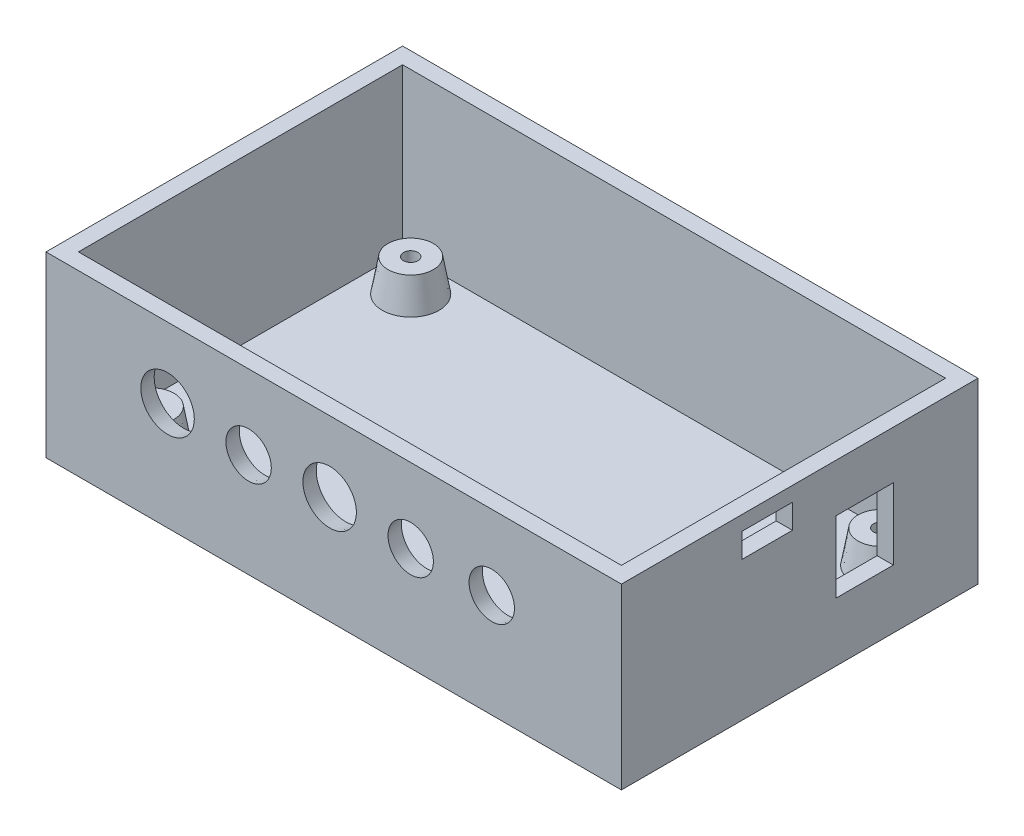
ISO-10303-21;
HEADER;
FILE_DESCRIPTION(('STEP AP214'),'2;1');
FILE_NAME('part.step','',(''),(''),'','','');
FILE_SCHEMA(('AUTOMOTIVE_DESIGN { 1 0 10303 214 1 1 1 1 }'));
ENDSEC;
DATA;
#1=APPLICATION_CONTEXT('core data for automotive mechanical design processes');
#2=APPLICATION_PROTOCOL_DEFINITION('international standard','automotive_design',2000,#1);
#3=PRODUCT_CONTEXT('',#1,'mechanical');
#4=PRODUCT('Part','Part','',(#3));
#5=PRODUCT_RELATED_PRODUCT_CATEGORY('part','',(#4));
#6=PRODUCT_DEFINITION_FORMATION('','',#4);
#7=PRODUCT_DEFINITION_CONTEXT('part definition',#1,'design');
#8=PRODUCT_DEFINITION('design','',#6,#7);
#9=PRODUCT_DEFINITION_SHAPE('','',#8);
#10=(LENGTH_UNIT() NAMED_UNIT(*) SI_UNIT(.MILLI.,.METRE.));
#11=(NAMED_UNIT(*) PLANE_ANGLE_UNIT() SI_UNIT($,.RADIAN.));
#12=(NAMED_UNIT(*) SI_UNIT($,.STERADIAN.) SOLID_ANGLE_UNIT());
#13=UNCERTAINTY_MEASURE_WITH_UNIT(LENGTH_MEASURE(1.E-05),#10,'distance_accuracy_value','');
#14=(GEOMETRIC_REPRESENTATION_CONTEXT(3) GLOBAL_UNCERTAINTY_ASSIGNED_CONTEXT((#13)) GLOBAL_UNIT_ASSIGNED_CONTEXT((#10,
#11,#12)) REPRESENTATION_CONTEXT('',''));
#15=CARTESIAN_POINT('',(0.,0.,0.));
#16=DIRECTION('',(0.,0.,1.));
#17=DIRECTION('',(1.,0.,0.));
#18=AXIS2_PLACEMENT_3D('',#15,#16,#17);
#19=CARTESIAN_POINT('',(45.085,27.94,-27.94));
#20=DIRECTION('',(-1.,0.,0.));
#21=DIRECTION('',(0.,0.,1.));
#22=AXIS2_PLACEMENT_3D('',#19,#20,#21);
#23=PLANE('',#22);
#24=DIRECTION('',(0.,0.,1.));
#25=VECTOR('',#24,1.);
#26=CARTESIAN_POINT('',(45.085,20.3962,-5.65150000000001));
#27=LINE('',#26,#25);
#28=CARTESIAN_POINT('',(45.085,20.3962,-14.6685));
#29=VERTEX_POINT('',#28);
#30=CARTESIAN_POINT('',(45.085,20.3962,-5.65150000000001));
#31=VERTEX_POINT('',#30);
#32=EDGE_CURVE('E181',#29,#31,#27,.T.);
#33=ORIENTED_EDGE('',*,*,#32,.F.);
#34=DIRECTION('',(0.,1.,0.));
#35=VECTOR('',#34,1.);
#36=CARTESIAN_POINT('',(45.085,9.2202,-14.6685));
#37=LINE('',#36,#35);
#38=CARTESIAN_POINT('',(45.085,9.2202,-14.6685));
#39=VERTEX_POINT('',#38);
#40=EDGE_CURVE('E47',#39,#29,#37,.T.);
#41=ORIENTED_EDGE('',*,*,#40,.F.);
#42=DIRECTION('',(0.,0.,-1.));
#43=VECTOR('',#42,1.);
#44=CARTESIAN_POINT('',(45.085,9.2202,-5.65150000000001));
#45=LINE('',#44,#43);
#46=CARTESIAN_POINT('',(45.085,9.2202,-5.65150000000001));
#47=VERTEX_POINT('',#46);
#48=EDGE_CURVE('E168',#47,#39,#45,.T.);
#49=ORIENTED_EDGE('',*,*,#48,.F.);
#50=DIRECTION('',(0.,-1.,0.));
#51=VECTOR('',#50,1.);
#52=CARTESIAN_POINT('',(45.085,9.2202,-5.65150000000001));
#53=LINE('',#52,#51);
#54=EDGE_CURVE('E176',#31,#47,#53,.T.);
#55=ORIENTED_EDGE('',*,*,#54,.F.);
#56=EDGE_LOOP('',(#33,#41,#49,#55));
#57=FACE_BOUND('',#56,.T.);
#58=DIRECTION('',(0.,0.,1.));
#59=VECTOR('',#58,1.);
#60=CARTESIAN_POINT('',(45.085,25.654,9.01700000000001));
#61=LINE('',#60,#59);
#62=CARTESIAN_POINT('',(45.085,25.654,1.14300000000001));
#63=VERTEX_POINT('',#62);
#64=CARTESIAN_POINT('',(45.085,25.654,9.01700000000001));
#65=VERTEX_POINT('',#64);
#66=EDGE_CURVE('E207',#63,#65,#61,.T.);
#67=ORIENTED_EDGE('',*,*,#66,.F.);
#68=DIRECTION('',(0.,1.,0.));
#69=VECTOR('',#68,1.);
#70=CARTESIAN_POINT('',(45.085,25.654,1.14300000000001));
#71=LINE('',#70,#69);
#72=CARTESIAN_POINT('',(45.085,21.844,1.14300000000001));
#73=VERTEX_POINT('',#72);
#74=EDGE_CURVE('E55',#73,#63,#71,.T.);
#75=ORIENTED_EDGE('',*,*,#74,.F.);
#76=DIRECTION('',(0.,0.,-1.));
#77=VECTOR('',#76,1.);
#78=CARTESIAN_POINT('',(45.085,21.844,9.01700000000001));
#79=LINE('',#78,#77);
#80=CARTESIAN_POINT('',(45.085,21.844,9.01700000000001));
#81=VERTEX_POINT('',#80);
#82=EDGE_CURVE('E191',#81,#73,#79,.T.);
#83=ORIENTED_EDGE('',*,*,#82,.F.);
#84=DIRECTION('',(0.,-1.,0.));
#85=VECTOR('',#84,1.);
#86=CARTESIAN_POINT('',(45.085,25.654,9.01700000000001));
#87=LINE('',#86,#85);
#88=EDGE_CURVE('E204',#65,#81,#87,.T.);
#89=ORIENTED_EDGE('',*,*,#88,.F.);
#90=EDGE_LOOP('',(#67,#75,#83,#89));
#91=FACE_BOUND('',#90,.T.);
#92=DIRECTION('',(0.,0.,-1.));
#93=VECTOR('',#92,1.);
#94=CARTESIAN_POINT('',(45.085,0.,-27.94));
#95=LINE('',#94,#93);
#96=CARTESIAN_POINT('',(45.085,0.,27.94));
#97=VERTEX_POINT('',#96);
#98=CARTESIAN_POINT('',(45.085,0.,-27.94));
#99=VERTEX_POINT('',#98);
#100=EDGE_CURVE('E310',#97,#99,#95,.T.);
#101=ORIENTED_EDGE('',*,*,#100,.T.);
#102=DIRECTION('',(0.,-1.,0.));
#103=VECTOR('',#102,1.);
#104=CARTESIAN_POINT('',(45.085,27.94,-27.94));
#105=LINE('',#104,#103);
#106=CARTESIAN_POINT('',(45.085,27.94,-27.94));
#107=VERTEX_POINT('',#106);
#108=EDGE_CURVE('E11',#107,#99,#105,.T.);
#109=ORIENTED_EDGE('',*,*,#108,.F.);
#110=DIRECTION('',(0.,0.,-1.));
#111=VECTOR('',#110,1.);
#112=CARTESIAN_POINT('',(45.085,27.94,-27.94));
#113=LINE('',#112,#111);
#114=CARTESIAN_POINT('',(45.085,27.94,27.94));
#115=VERTEX_POINT('',#114);
#116=EDGE_CURVE('E334',#115,#107,#113,.T.);
#117=ORIENTED_EDGE('',*,*,#116,.F.);
#118=DIRECTION('',(0.,-1.,0.));
#119=VECTOR('',#118,1.);
#120=CARTESIAN_POINT('',(45.085,27.94,27.94));
#121=LINE('',#120,#119);
#122=EDGE_CURVE('E344',#115,#97,#121,.T.);
#123=ORIENTED_EDGE('',*,*,#122,.T.);
#124=EDGE_LOOP('',(#101,#109,#117,#123));
#125=FACE_BOUND('',#124,.T.);
#126=ADVANCED_FACE('F33',(#57,#91,#125),#23,.F.);
#127=CARTESIAN_POINT('',(-45.085,27.94,-27.94));
#128=DIRECTION('',(0.,0.,1.));
#129=DIRECTION('',(1.,0.,0.));
#130=AXIS2_PLACEMENT_3D('',#127,#128,#129);
#131=PLANE('',#130);
#132=DIRECTION('',(-1.,0.,0.));
#133=VECTOR('',#132,1.);
#134=CARTESIAN_POINT('',(-45.085,0.,-27.94));
#135=LINE('',#134,#133);
#136=CARTESIAN_POINT('',(-45.085,0.,-27.94));
#137=VERTEX_POINT('',#136);
#138=EDGE_CURVE('E347',#99,#137,#135,.T.);
#139=ORIENTED_EDGE('',*,*,#138,.T.);
#140=DIRECTION('',(0.,-1.,0.));
#141=VECTOR('',#140,1.);
#142=CARTESIAN_POINT('',(-45.085,27.94,-27.94));
#143=LINE('',#142,#141);
#144=CARTESIAN_POINT('',(-45.085,27.94,-27.94));
#145=VERTEX_POINT('',#144);
#146=EDGE_CURVE('E40',#145,#137,#143,.T.);
#147=ORIENTED_EDGE('',*,*,#146,.F.);
#148=DIRECTION('',(-1.,0.,0.));
#149=VECTOR('',#148,1.);
#150=CARTESIAN_POINT('',(-45.085,27.94,-27.94));
#151=LINE('',#150,#149);
#152=EDGE_CURVE('E337',#107,#145,#151,.T.);
#153=ORIENTED_EDGE('',*,*,#152,.F.);
#154=ORIENTED_EDGE('',*,*,#108,.T.);
#155=EDGE_LOOP('',(#139,#147,#153,#154));
#156=FACE_BOUND('',#155,.T.);
#157=ADVANCED_FACE('F377',(#156),#131,.F.);
#158=CARTESIAN_POINT('',(-45.085,27.94,-27.94));
#159=DIRECTION('',(1.,0.,0.));
#160=DIRECTION('',(0.,0.,-1.));
#161=AXIS2_PLACEMENT_3D('',#158,#159,#160);
#162=PLANE('',#161);
#163=DIRECTION('',(0.,0.,1.));
#164=VECTOR('',#163,1.);
#165=CARTESIAN_POINT('',(-45.085,0.,-27.94));
#166=LINE('',#165,#164);
#167=CARTESIAN_POINT('',(-45.085,0.,27.94));
#168=VERTEX_POINT('',#167);
#169=EDGE_CURVE('E349',#137,#168,#166,.T.);
#170=ORIENTED_EDGE('',*,*,#169,.T.);
#171=DIRECTION('',(0.,-1.,0.));
#172=VECTOR('',#171,1.);
#173=CARTESIAN_POINT('',(-45.085,27.94,27.94));
#174=LINE('',#173,#172);
#175=CARTESIAN_POINT('',(-45.085,27.94,27.94));
#176=VERTEX_POINT('',#175);
#177=EDGE_CURVE('E354',#176,#168,#174,.T.);
#178=ORIENTED_EDGE('',*,*,#177,.F.);
#179=DIRECTION('',(0.,0.,1.));
#180=VECTOR('',#179,1.);
#181=CARTESIAN_POINT('',(-45.085,27.94,-27.94));
#182=LINE('',#181,#180);
#183=EDGE_CURVE('E340',#145,#176,#182,.T.);
#184=ORIENTED_EDGE('',*,*,#183,.F.);
#185=ORIENTED_EDGE('',*,*,#146,.T.);
#186=EDGE_LOOP('',(#170,#178,#184,#185));
#187=FACE_BOUND('',#186,.T.);
#188=ADVANCED_FACE('F361',(#187),#162,.F.);
#189=CARTESIAN_POINT('',(-45.085,27.94,27.94));
#190=DIRECTION('',(0.,0.,-1.));
#191=DIRECTION('',(-1.,0.,0.));
#192=AXIS2_PLACEMENT_3D('',#189,#190,#191);
#193=PLANE('',#192);
#194=CARTESIAN_POINT('',(24.765,16.256,27.94));
#195=DIRECTION('',(0.,0.,1.));
#196=DIRECTION('',(1.,0.,0.));
#197=AXIS2_PLACEMENT_3D('',#194,#195,#196);
#198=CIRCLE('',#197,3.556);
#199=CARTESIAN_POINT('',(28.321,16.256,27.94));
#200=VERTEX_POINT('',#199);
#201=EDGE_CURVE('E226',#200,#200,#198,.T.);
#202=ORIENTED_EDGE('',*,*,#201,.F.);
#203=EDGE_LOOP('',(#202));
#204=FACE_BOUND('',#203,.T.);
#205=CARTESIAN_POINT('',(-0.635000000000004,16.891,27.94));
#206=DIRECTION('',(0.,0.,1.));
#207=DIRECTION('',(1.,0.,0.));
#208=AXIS2_PLACEMENT_3D('',#205,#206,#207);
#209=CIRCLE('',#208,4.191);
#210=CARTESIAN_POINT('',(3.556,16.891,27.94));
#211=VERTEX_POINT('',#210);
#212=EDGE_CURVE('E238',#211,#211,#209,.T.);
#213=ORIENTED_EDGE('',*,*,#212,.F.);
#214=EDGE_LOOP('',(#213));
#215=FACE_BOUND('',#214,.T.);
#216=CARTESIAN_POINT('',(-26.035,16.891,27.94));
#217=DIRECTION('',(0.,0.,1.));
#218=DIRECTION('',(1.,0.,0.));
#219=AXIS2_PLACEMENT_3D('',#216,#217,#218);
#220=CIRCLE('',#219,4.191);
#221=CARTESIAN_POINT('',(-21.844,16.891,27.94));
#222=VERTEX_POINT('',#221);
#223=EDGE_CURVE('E237',#222,#222,#220,.T.);
#224=ORIENTED_EDGE('',*,*,#223,.F.);
#225=EDGE_LOOP('',(#224));
#226=FACE_BOUND('',#225,.T.);
#227=CARTESIAN_POINT('',(-13.335,16.256,27.94));
#228=DIRECTION('',(0.,0.,1.));
#229=DIRECTION('',(1.,0.,0.));
#230=AXIS2_PLACEMENT_3D('',#227,#228,#229);
#231=CIRCLE('',#230,3.556);
#232=CARTESIAN_POINT('',(-9.779,16.256,27.94));
#233=VERTEX_POINT('',#232);
#234=EDGE_CURVE('E251',#233,#233,#231,.T.);
#235=ORIENTED_EDGE('',*,*,#234,.F.);
#236=EDGE_LOOP('',(#235));
#237=FACE_BOUND('',#236,.T.);
#238=CARTESIAN_POINT('',(12.065,16.256,27.94));
#239=DIRECTION('',(0.,0.,1.));
#240=DIRECTION('',(1.,0.,0.));
#241=AXIS2_PLACEMENT_3D('',#238,#239,#240);
#242=CIRCLE('',#241,3.556);
#243=CARTESIAN_POINT('',(15.621,16.256,27.94));
#244=VERTEX_POINT('',#243);
#245=EDGE_CURVE('E233',#244,#244,#242,.T.);
#246=ORIENTED_EDGE('',*,*,#245,.F.);
#247=EDGE_LOOP('',(#246));
#248=FACE_BOUND('',#247,.T.);
#249=DIRECTION('',(1.,0.,0.));
#250=VECTOR('',#249,1.);
#251=CARTESIAN_POINT('',(-45.085,0.,27.94));
#252=LINE('',#251,#250);
#253=EDGE_CURVE('E338',#168,#97,#252,.T.);
#254=ORIENTED_EDGE('',*,*,#253,.T.);
#255=ORIENTED_EDGE('',*,*,#122,.F.);
#256=DIRECTION('',(1.,0.,0.));
#257=VECTOR('',#256,1.);
#258=CARTESIAN_POINT('',(-45.085,27.94,27.94));
#259=LINE('',#258,#257);
#260=EDGE_CURVE('E342',#176,#115,#259,.T.);
#261=ORIENTED_EDGE('',*,*,#260,.F.);
#262=ORIENTED_EDGE('',*,*,#177,.T.);
#263=EDGE_LOOP('',(#254,#255,#261,#262));
#264=FACE_BOUND('',#263,.T.);
#265=ADVANCED_FACE('F370',(#204,#215,#226,#237,#248,#264),#193,.F.);
#266=CARTESIAN_POINT('',(0.,27.94,0.));
#267=DIRECTION('',(0.,1.,0.));
#268=DIRECTION('',(0.,0.,1.));
#269=AXIS2_PLACEMENT_3D('',#266,#267,#268);
#270=PLANE('',#269);
#271=DIRECTION('',(0.,0.,-1.));
#272=VECTOR('',#271,1.);
#273=CARTESIAN_POINT('',(42.545,27.94,-27.94));
#274=LINE('',#273,#272);
#275=CARTESIAN_POINT('',(42.545,27.94,25.4));
#276=VERTEX_POINT('',#275);
#277=CARTESIAN_POINT('',(42.545,27.94,-25.4));
#278=VERTEX_POINT('',#277);
#279=EDGE_CURVE('E326',#276,#278,#274,.T.);
#280=ORIENTED_EDGE('',*,*,#279,.F.);
#281=DIRECTION('',(1.,0.,0.));
#282=VECTOR('',#281,1.);
#283=CARTESIAN_POINT('',(-45.085,27.94,25.4));
#284=LINE('',#283,#282);
#285=CARTESIAN_POINT('',(-42.545,27.94,25.4));
#286=VERTEX_POINT('',#285);
#287=EDGE_CURVE('E316',#286,#276,#284,.T.);
#288=ORIENTED_EDGE('',*,*,#287,.F.);
#289=DIRECTION('',(0.,0.,1.));
#290=VECTOR('',#289,1.);
#291=CARTESIAN_POINT('',(-42.545,27.94,-27.94));
#292=LINE('',#291,#290);
#293=CARTESIAN_POINT('',(-42.545,27.94,-25.4));
#294=VERTEX_POINT('',#293);
#295=EDGE_CURVE('E330',#294,#286,#292,.T.);
#296=ORIENTED_EDGE('',*,*,#295,.F.);
#297=DIRECTION('',(-1.,0.,0.));
#298=VECTOR('',#297,1.);
#299=CARTESIAN_POINT('',(-45.085,27.94,-25.4));
#300=LINE('',#299,#298);
#301=EDGE_CURVE('E328',#278,#294,#300,.T.);
#302=ORIENTED_EDGE('',*,*,#301,.F.);
#303=EDGE_LOOP('',(#280,#288,#296,#302));
#304=FACE_BOUND('',#303,.T.);
#305=ORIENTED_EDGE('',*,*,#116,.T.);
#306=ORIENTED_EDGE('',*,*,#152,.T.);
#307=ORIENTED_EDGE('',*,*,#183,.T.);
#308=ORIENTED_EDGE('',*,*,#260,.T.);
#309=EDGE_LOOP('',(#305,#306,#307,#308));
#310=FACE_BOUND('',#309,.T.);
#311=ADVANCED_FACE('F376',(#304,#310),#270,.T.);
#312=CARTESIAN_POINT('',(0.,0.,0.));
#313=DIRECTION('',(0.,1.,0.));
#314=DIRECTION('',(0.,0.,1.));
#315=AXIS2_PLACEMENT_3D('',#312,#313,#314);
#316=PLANE('',#315);
#317=ORIENTED_EDGE('',*,*,#100,.F.);
#318=ORIENTED_EDGE('',*,*,#253,.F.);
#319=ORIENTED_EDGE('',*,*,#169,.F.);
#320=ORIENTED_EDGE('',*,*,#138,.F.);
#321=EDGE_LOOP('',(#317,#318,#319,#320));
#322=FACE_BOUND('',#321,.T.);
#323=ADVANCED_FACE('F367',(#322),#316,.F.);
#324=CARTESIAN_POINT('',(42.545,27.94,-27.94));
#325=DIRECTION('',(-1.,0.,0.));
#326=DIRECTION('',(0.,0.,1.));
#327=AXIS2_PLACEMENT_3D('',#324,#325,#326);
#328=PLANE('',#327);
#329=DIRECTION('',(0.,1.,0.));
#330=VECTOR('',#329,1.);
#331=CARTESIAN_POINT('',(42.545,9.2202,-14.6685));
#332=LINE('',#331,#330);
#333=CARTESIAN_POINT('',(42.545,9.2202,-14.6685));
#334=VERTEX_POINT('',#333);
#335=CARTESIAN_POINT('',(42.545,20.3962,-14.6685));
#336=VERTEX_POINT('',#335);
#337=EDGE_CURVE('E161',#334,#336,#332,.T.);
#338=ORIENTED_EDGE('',*,*,#337,.T.);
#339=DIRECTION('',(0.,0.,1.));
#340=VECTOR('',#339,1.);
#341=CARTESIAN_POINT('',(42.545,20.3962,-5.65150000000001));
#342=LINE('',#341,#340);
#343=CARTESIAN_POINT('',(42.545,20.3962,-5.65150000000001));
#344=VERTEX_POINT('',#343);
#345=EDGE_CURVE('E185',#336,#344,#342,.T.);
#346=ORIENTED_EDGE('',*,*,#345,.T.);
#347=DIRECTION('',(0.,-1.,0.));
#348=VECTOR('',#347,1.);
#349=CARTESIAN_POINT('',(42.545,9.2202,-5.65150000000001));
#350=LINE('',#349,#348);
#351=CARTESIAN_POINT('',(42.545,9.2202,-5.65150000000001));
#352=VERTEX_POINT('',#351);
#353=EDGE_CURVE('E164',#344,#352,#350,.T.);
#354=ORIENTED_EDGE('',*,*,#353,.T.);
#355=DIRECTION('',(0.,0.,-1.));
#356=VECTOR('',#355,1.);
#357=CARTESIAN_POINT('',(42.545,9.2202,-5.65150000000001));
#358=LINE('',#357,#356);
#359=EDGE_CURVE('E165',#352,#334,#358,.T.);
#360=ORIENTED_EDGE('',*,*,#359,.T.);
#361=EDGE_LOOP('',(#338,#346,#354,#360));
#362=FACE_BOUND('',#361,.T.);
#363=DIRECTION('',(0.,1.,0.));
#364=VECTOR('',#363,1.);
#365=CARTESIAN_POINT('',(42.545,25.654,1.14300000000001));
#366=LINE('',#365,#364);
#367=CARTESIAN_POINT('',(42.545,21.844,1.14300000000001));
#368=VERTEX_POINT('',#367);
#369=CARTESIAN_POINT('',(42.545,25.654,1.14300000000001));
#370=VERTEX_POINT('',#369);
#371=EDGE_CURVE('E211',#368,#370,#366,.T.);
#372=ORIENTED_EDGE('',*,*,#371,.T.);
#373=DIRECTION('',(0.,0.,1.));
#374=VECTOR('',#373,1.);
#375=CARTESIAN_POINT('',(42.545,25.654,9.01700000000001));
#376=LINE('',#375,#374);
#377=CARTESIAN_POINT('',(42.545,25.654,9.017));
#378=VERTEX_POINT('',#377);
#379=EDGE_CURVE('E197',#370,#378,#376,.T.);
#380=ORIENTED_EDGE('',*,*,#379,.T.);
#381=DIRECTION('',(0.,-1.,0.));
#382=VECTOR('',#381,1.);
#383=CARTESIAN_POINT('',(42.545,25.654,9.01700000000001));
#384=LINE('',#383,#382);
#385=CARTESIAN_POINT('',(42.545,21.844,9.01700000000001));
#386=VERTEX_POINT('',#385);
#387=EDGE_CURVE('E219',#378,#386,#384,.T.);
#388=ORIENTED_EDGE('',*,*,#387,.T.);
#389=DIRECTION('',(0.,0.,-1.));
#390=VECTOR('',#389,1.);
#391=CARTESIAN_POINT('',(42.545,21.844,9.01700000000001));
#392=LINE('',#391,#390);
#393=EDGE_CURVE('E215',#386,#368,#392,.T.);
#394=ORIENTED_EDGE('',*,*,#393,.T.);
#395=EDGE_LOOP('',(#372,#380,#388,#394));
#396=FACE_BOUND('',#395,.T.);
#397=DIRECTION('',(0.,0.,-1.));
#398=VECTOR('',#397,1.);
#399=CARTESIAN_POINT('',(42.545,2.54,-27.94));
#400=LINE('',#399,#398);
#401=CARTESIAN_POINT('',(42.545,2.54,25.4));
#402=VERTEX_POINT('',#401);
#403=CARTESIAN_POINT('',(42.545,2.54,-25.4));
#404=VERTEX_POINT('',#403);
#405=EDGE_CURVE('E303',#402,#404,#400,.T.);
#406=ORIENTED_EDGE('',*,*,#405,.F.);
#407=DIRECTION('',(0.,-1.,0.));
#408=VECTOR('',#407,1.);
#409=CARTESIAN_POINT('',(42.545,27.94,25.4));
#410=LINE('',#409,#408);
#411=EDGE_CURVE('E312',#276,#402,#410,.T.);
#412=ORIENTED_EDGE('',*,*,#411,.F.);
#413=ORIENTED_EDGE('',*,*,#279,.T.);
#414=DIRECTION('',(0.,-1.,0.));
#415=VECTOR('',#414,1.);
#416=CARTESIAN_POINT('',(42.545,27.94,-25.4));
#417=LINE('',#416,#415);
#418=EDGE_CURVE('E307',#278,#404,#417,.T.);
#419=ORIENTED_EDGE('',*,*,#418,.T.);
#420=EDGE_LOOP('',(#406,#412,#413,#419));
#421=FACE_BOUND('',#420,.T.);
#422=ADVANCED_FACE('F390',(#362,#396,#421),#328,.T.);
#423=CARTESIAN_POINT('',(-45.085,27.94,-25.4));
#424=DIRECTION('',(0.,0.,1.));
#425=DIRECTION('',(1.,0.,0.));
#426=AXIS2_PLACEMENT_3D('',#423,#424,#425);
#427=PLANE('',#426);
#428=DIRECTION('',(-1.,0.,0.));
#429=VECTOR('',#428,1.);
#430=CARTESIAN_POINT('',(-45.085,2.54,-25.4));
#431=LINE('',#430,#429);
#432=CARTESIAN_POINT('',(-42.545,2.54,-25.4));
#433=VERTEX_POINT('',#432);
#434=EDGE_CURVE('E306',#404,#433,#431,.T.);
#435=ORIENTED_EDGE('',*,*,#434,.F.);
#436=ORIENTED_EDGE('',*,*,#418,.F.);
#437=ORIENTED_EDGE('',*,*,#301,.T.);
#438=DIRECTION('',(0.,-1.,0.));
#439=VECTOR('',#438,1.);
#440=CARTESIAN_POINT('',(-42.545,27.94,-25.4));
#441=LINE('',#440,#439);
#442=EDGE_CURVE('E311',#294,#433,#441,.T.);
#443=ORIENTED_EDGE('',*,*,#442,.T.);
#444=EDGE_LOOP('',(#435,#436,#437,#443));
#445=FACE_BOUND('',#444,.T.);
#446=ADVANCED_FACE('F406',(#445),#427,.T.);
#447=CARTESIAN_POINT('',(-42.545,27.94,-27.94));
#448=DIRECTION('',(1.,0.,0.));
#449=DIRECTION('',(0.,0.,-1.));
#450=AXIS2_PLACEMENT_3D('',#447,#448,#449);
#451=PLANE('',#450);
#452=DIRECTION('',(0.,0.,1.));
#453=VECTOR('',#452,1.);
#454=CARTESIAN_POINT('',(-42.545,2.54,-27.94));
#455=LINE('',#454,#453);
#456=CARTESIAN_POINT('',(-42.545,2.54,25.4));
#457=VERTEX_POINT('',#456);
#458=EDGE_CURVE('E318',#433,#457,#455,.T.);
#459=ORIENTED_EDGE('',*,*,#458,.F.);
#460=ORIENTED_EDGE('',*,*,#442,.F.);
#461=ORIENTED_EDGE('',*,*,#295,.T.);
#462=DIRECTION('',(0.,-1.,0.));
#463=VECTOR('',#462,1.);
#464=CARTESIAN_POINT('',(-42.545,27.94,25.4));
#465=LINE('',#464,#463);
#466=EDGE_CURVE('E315',#286,#457,#465,.T.);
#467=ORIENTED_EDGE('',*,*,#466,.T.);
#468=EDGE_LOOP('',(#459,#460,#461,#467));
#469=FACE_BOUND('',#468,.T.);
#470=ADVANCED_FACE('F402',(#469),#451,.T.);
#471=CARTESIAN_POINT('',(-45.085,27.94,25.4));
#472=DIRECTION('',(0.,0.,-1.));
#473=DIRECTION('',(-1.,0.,0.));
#474=AXIS2_PLACEMENT_3D('',#471,#472,#473);
#475=PLANE('',#474);
#476=CARTESIAN_POINT('',(24.765,16.256,25.4));
#477=DIRECTION('',(0.,0.,-1.));
#478=DIRECTION('',(-1.,0.,0.));
#479=AXIS2_PLACEMENT_3D('',#476,#477,#478);
#480=CIRCLE('',#479,4.0038705309995);
#481=CARTESIAN_POINT('',(20.7611294690005,16.256,25.4));
#482=VERTEX_POINT('',#481);
#483=EDGE_CURVE('E230',#482,#482,#480,.F.);
#484=ORIENTED_EDGE('',*,*,#483,.T.);
#485=EDGE_LOOP('',(#484));
#486=FACE_BOUND('',#485,.T.);
#487=CARTESIAN_POINT('',(-0.635000000000004,16.891,25.4));
#488=DIRECTION('',(0.,0.,-1.));
#489=DIRECTION('',(-1.,0.,0.));
#490=AXIS2_PLACEMENT_3D('',#487,#488,#489);
#491=CIRCLE('',#490,4.6388705309995);
#492=CARTESIAN_POINT('',(-5.27387053099951,16.891,25.4));
#493=VERTEX_POINT('',#492);
#494=EDGE_CURVE('E175',#493,#493,#491,.F.);
#495=ORIENTED_EDGE('',*,*,#494,.T.);
#496=EDGE_LOOP('',(#495));
#497=FACE_BOUND('',#496,.T.);
#498=CARTESIAN_POINT('',(-26.035,16.891,25.4));
#499=DIRECTION('',(0.,0.,-1.));
#500=DIRECTION('',(-1.,0.,0.));
#501=AXIS2_PLACEMENT_3D('',#498,#499,#500);
#502=CIRCLE('',#501,4.6388705309995);
#503=CARTESIAN_POINT('',(-30.6738705309995,16.891,25.4));
#504=VERTEX_POINT('',#503);
#505=EDGE_CURVE('E234',#504,#504,#502,.F.);
#506=ORIENTED_EDGE('',*,*,#505,.T.);
#507=EDGE_LOOP('',(#506));
#508=FACE_BOUND('',#507,.T.);
#509=CARTESIAN_POINT('',(-13.335,16.256,25.4));
#510=DIRECTION('',(0.,0.,-1.));
#511=DIRECTION('',(-1.,0.,0.));
#512=AXIS2_PLACEMENT_3D('',#509,#510,#511);
#513=CIRCLE('',#512,4.0038705309995);
#514=CARTESIAN_POINT('',(-17.3388705309995,16.256,25.4));
#515=VERTEX_POINT('',#514);
#516=EDGE_CURVE('E241',#515,#515,#513,.F.);
#517=ORIENTED_EDGE('',*,*,#516,.T.);
#518=EDGE_LOOP('',(#517));
#519=FACE_BOUND('',#518,.T.);
#520=CARTESIAN_POINT('',(12.065,16.256,25.4));
#521=DIRECTION('',(0.,0.,-1.));
#522=DIRECTION('',(-1.,0.,0.));
#523=AXIS2_PLACEMENT_3D('',#520,#521,#522);
#524=CIRCLE('',#523,4.0038705309995);
#525=CARTESIAN_POINT('',(8.0611294690005,16.256,25.4));
#526=VERTEX_POINT('',#525);
#527=EDGE_CURVE('E248',#526,#526,#524,.F.);
#528=ORIENTED_EDGE('',*,*,#527,.T.);
#529=EDGE_LOOP('',(#528));
#530=FACE_BOUND('',#529,.T.);
#531=DIRECTION('',(1.,0.,0.));
#532=VECTOR('',#531,1.);
#533=CARTESIAN_POINT('',(-45.085,2.54,25.4));
#534=LINE('',#533,#532);
#535=EDGE_CURVE('E322',#457,#402,#534,.T.);
#536=ORIENTED_EDGE('',*,*,#535,.F.);
#537=ORIENTED_EDGE('',*,*,#466,.F.);
#538=ORIENTED_EDGE('',*,*,#287,.T.);
#539=ORIENTED_EDGE('',*,*,#411,.T.);
#540=EDGE_LOOP('',(#536,#537,#538,#539));
#541=FACE_BOUND('',#540,.T.);
#542=ADVANCED_FACE('F398',(#486,#497,#508,#519,#530,#541),#475,.T.);
#543=CARTESIAN_POINT('',(0.,2.54,0.));
#544=DIRECTION('',(0.,1.,0.));
#545=DIRECTION('',(0.,0.,1.));
#546=AXIS2_PLACEMENT_3D('',#543,#544,#545);
#547=PLANE('',#546);
#548=CARTESIAN_POINT('',(-36.195,2.54,-20.32));
#549=DIRECTION('',(0.,1.,0.));
#550=DIRECTION('',(0.,0.,-1.));
#551=AXIS2_PLACEMENT_3D('',#548,#549,#550);
#552=CIRCLE('',#551,4.44499999999999);
#553=CARTESIAN_POINT('',(-36.195,2.54,-24.765));
#554=VERTEX_POINT('',#553);
#555=EDGE_CURVE('E279',#554,#554,#552,.T.);
#556=ORIENTED_EDGE('',*,*,#555,.F.);
#557=EDGE_LOOP('',(#556));
#558=FACE_BOUND('',#557,.T.);
#559=CARTESIAN_POINT('',(-36.195,2.54,20.32));
#560=DIRECTION('',(0.,1.,0.));
#561=DIRECTION('',(0.,0.,1.));
#562=AXIS2_PLACEMENT_3D('',#559,#560,#561);
#563=CIRCLE('',#562,4.44499999999999);
#564=CARTESIAN_POINT('',(-36.195,2.54,24.765));
#565=VERTEX_POINT('',#564);
#566=EDGE_CURVE('E285',#565,#565,#563,.T.);
#567=ORIENTED_EDGE('',*,*,#566,.F.);
#568=EDGE_LOOP('',(#567));
#569=FACE_BOUND('',#568,.T.);
#570=CARTESIAN_POINT('',(37.465,2.54,20.32));
#571=DIRECTION('',(0.,1.,0.));
#572=DIRECTION('',(0.,0.,-1.));
#573=AXIS2_PLACEMENT_3D('',#570,#571,#572);
#574=CIRCLE('',#573,4.44499999999999);
#575=CARTESIAN_POINT('',(37.465,2.54,15.875));
#576=VERTEX_POINT('',#575);
#577=EDGE_CURVE('E291',#576,#576,#574,.T.);
#578=ORIENTED_EDGE('',*,*,#577,.F.);
#579=EDGE_LOOP('',(#578));
#580=FACE_BOUND('',#579,.T.);
#581=CARTESIAN_POINT('',(37.465,2.54,-20.32));
#582=DIRECTION('',(0.,1.,0.));
#583=DIRECTION('',(0.,0.,1.));
#584=AXIS2_PLACEMENT_3D('',#581,#582,#583);
#585=CIRCLE('',#584,4.44499999999999);
#586=CARTESIAN_POINT('',(37.465,2.54,-15.875));
#587=VERTEX_POINT('',#586);
#588=EDGE_CURVE('E297',#587,#587,#585,.T.);
#589=ORIENTED_EDGE('',*,*,#588,.F.);
#590=EDGE_LOOP('',(#589));
#591=FACE_BOUND('',#590,.T.);
#592=ORIENTED_EDGE('',*,*,#405,.T.);
#593=ORIENTED_EDGE('',*,*,#434,.T.);
#594=ORIENTED_EDGE('',*,*,#458,.T.);
#595=ORIENTED_EDGE('',*,*,#535,.T.);
#596=EDGE_LOOP('',(#592,#593,#594,#595));
#597=FACE_BOUND('',#596,.T.);
#598=ADVANCED_FACE('F394',(#558,#569,#580,#591,#597),#547,.T.);
#599=CARTESIAN_POINT('',(37.465,2.54,-20.32));
#600=DIRECTION('',(0.,-1.,0.));
#601=DIRECTION('',(0.,0.,1.));
#602=AXIS2_PLACEMENT_3D('',#599,#600,#601);
#603=CONICAL_SURFACE('',#602,4.44499999999999,0.174532925199433);
#604=CARTESIAN_POINT('',(37.465,7.62,-20.32));
#605=DIRECTION('',(0.,1.,0.));
#606=DIRECTION('',(0.,0.,1.));
#607=AXIS2_PLACEMENT_3D('',#604,#605,#606);
#608=CIRCLE('',#607,3.54925893800099);
#609=CARTESIAN_POINT('',(37.465,7.62,-16.770741061999));
#610=VERTEX_POINT('',#609);
#611=EDGE_CURVE('E300',#610,#610,#608,.T.);
#612=ORIENTED_EDGE('',*,*,#611,.F.);
#613=EDGE_LOOP('',(#612));
#614=FACE_BOUND('',#613,.T.);
#615=ORIENTED_EDGE('',*,*,#588,.T.);
#616=EDGE_LOOP('',(#615));
#617=FACE_BOUND('',#616,.T.);
#618=ADVANCED_FACE('F397',(#614,#617),#603,.T.);
#619=CARTESIAN_POINT('',(37.465,7.62,-20.32));
#620=DIRECTION('',(0.,1.,0.));
#621=DIRECTION('',(0.,0.,1.));
#622=AXIS2_PLACEMENT_3D('',#619,#620,#621);
#623=PLANE('',#622);
#624=CARTESIAN_POINT('',(37.465,7.62,-20.32));
#625=DIRECTION('',(0.,1.,0.));
#626=DIRECTION('',(0.,0.,1.));
#627=AXIS2_PLACEMENT_3D('',#624,#625,#626);
#628=CIRCLE('',#627,1.13029999999999);
#629=CARTESIAN_POINT('',(37.465,7.62,-19.1897));
#630=VERTEX_POINT('',#629);
#631=EDGE_CURVE('E273',#630,#630,#628,.T.);
#632=ORIENTED_EDGE('',*,*,#631,.F.);
#633=EDGE_LOOP('',(#632));
#634=FACE_BOUND('',#633,.T.);
#635=ORIENTED_EDGE('',*,*,#611,.T.);
#636=EDGE_LOOP('',(#635));
#637=FACE_BOUND('',#636,.T.);
#638=ADVANCED_FACE('F416',(#634,#637),#623,.T.);
#639=CARTESIAN_POINT('',(37.465,2.54,20.32));
#640=DIRECTION('',(0.,-1.,0.));
#641=DIRECTION('',(0.,0.,-1.));
#642=AXIS2_PLACEMENT_3D('',#639,#640,#641);
#643=CONICAL_SURFACE('',#642,4.44499999999999,0.174532925199433);
#644=CARTESIAN_POINT('',(37.465,7.62,20.32));
#645=DIRECTION('',(0.,-1.,0.));
#646=DIRECTION('',(0.,0.,-1.));
#647=AXIS2_PLACEMENT_3D('',#644,#645,#646);
#648=CIRCLE('',#647,3.54925893800099);
#649=CARTESIAN_POINT('',(37.465,7.62,16.770741061999));
#650=VERTEX_POINT('',#649);
#651=EDGE_CURVE('E294',#650,#650,#648,.F.);
#652=ORIENTED_EDGE('',*,*,#651,.F.);
#653=EDGE_LOOP('',(#652));
#654=FACE_BOUND('',#653,.T.);
#655=ORIENTED_EDGE('',*,*,#577,.T.);
#656=EDGE_LOOP('',(#655));
#657=FACE_BOUND('',#656,.T.);
#658=ADVANCED_FACE('F420',(#654,#657),#643,.T.);
#659=CARTESIAN_POINT('',(37.465,7.62,20.32));
#660=DIRECTION('',(0.,-1.,0.));
#661=DIRECTION('',(0.,0.,-1.));
#662=AXIS2_PLACEMENT_3D('',#659,#660,#661);
#663=PLANE('',#662);
#664=CARTESIAN_POINT('',(37.465,7.62,20.32));
#665=DIRECTION('',(0.,1.,0.));
#666=DIRECTION('',(0.,0.,1.));
#667=AXIS2_PLACEMENT_3D('',#664,#665,#666);
#668=CIRCLE('',#667,1.13029999999999);
#669=CARTESIAN_POINT('',(37.465,7.62,21.4503));
#670=VERTEX_POINT('',#669);
#671=EDGE_CURVE('E267',#670,#670,#668,.T.);
#672=ORIENTED_EDGE('',*,*,#671,.F.);
#673=EDGE_LOOP('',(#672));
#674=FACE_BOUND('',#673,.T.);
#675=ORIENTED_EDGE('',*,*,#651,.T.);
#676=EDGE_LOOP('',(#675));
#677=FACE_BOUND('',#676,.T.);
#678=ADVANCED_FACE('F424',(#674,#677),#663,.F.);
#679=CARTESIAN_POINT('',(-36.195,2.54,20.32));
#680=DIRECTION('',(0.,-1.,0.));
#681=DIRECTION('',(0.,0.,1.));
#682=AXIS2_PLACEMENT_3D('',#679,#680,#681);
#683=CONICAL_SURFACE('',#682,4.44499999999999,0.174532925199433);
#684=CARTESIAN_POINT('',(-36.195,7.62,20.32));
#685=DIRECTION('',(0.,1.,0.));
#686=DIRECTION('',(0.,0.,1.));
#687=AXIS2_PLACEMENT_3D('',#684,#685,#686);
#688=CIRCLE('',#687,3.54925893800099);
#689=CARTESIAN_POINT('',(-36.195,7.62,23.869258938001));
#690=VERTEX_POINT('',#689);
#691=EDGE_CURVE('E288',#690,#690,#688,.T.);
#692=ORIENTED_EDGE('',*,*,#691,.F.);
#693=EDGE_LOOP('',(#692));
#694=FACE_BOUND('',#693,.T.);
#695=ORIENTED_EDGE('',*,*,#566,.T.);
#696=EDGE_LOOP('',(#695));
#697=FACE_BOUND('',#696,.T.);
#698=ADVANCED_FACE('F428',(#694,#697),#683,.T.);
#699=CARTESIAN_POINT('',(-36.195,7.62,20.32));
#700=DIRECTION('',(0.,1.,0.));
#701=DIRECTION('',(0.,0.,1.));
#702=AXIS2_PLACEMENT_3D('',#699,#700,#701);
#703=PLANE('',#702);
#704=CARTESIAN_POINT('',(-36.195,7.62,20.32));
#705=DIRECTION('',(0.,1.,0.));
#706=DIRECTION('',(0.,0.,1.));
#707=AXIS2_PLACEMENT_3D('',#704,#705,#706);
#708=CIRCLE('',#707,1.13029999999999);
#709=CARTESIAN_POINT('',(-36.195,7.62,21.4503));
#710=VERTEX_POINT('',#709);
#711=EDGE_CURVE('E261',#710,#710,#708,.T.);
#712=ORIENTED_EDGE('',*,*,#711,.F.);
#713=EDGE_LOOP('',(#712));
#714=FACE_BOUND('',#713,.T.);
#715=ORIENTED_EDGE('',*,*,#691,.T.);
#716=EDGE_LOOP('',(#715));
#717=FACE_BOUND('',#716,.T.);
#718=ADVANCED_FACE('F432',(#714,#717),#703,.T.);
#719=CARTESIAN_POINT('',(-36.195,2.54,-20.32));
#720=DIRECTION('',(0.,-1.,0.));
#721=DIRECTION('',(0.,0.,-1.));
#722=AXIS2_PLACEMENT_3D('',#719,#720,#721);
#723=CONICAL_SURFACE('',#722,4.44499999999999,0.174532925199433);
#724=CARTESIAN_POINT('',(-36.195,7.62,-20.32));
#725=DIRECTION('',(0.,-1.,0.));
#726=DIRECTION('',(0.,0.,-1.));
#727=AXIS2_PLACEMENT_3D('',#724,#725,#726);
#728=CIRCLE('',#727,3.54925893800099);
#729=CARTESIAN_POINT('',(-36.195,7.62,-23.869258938001));
#730=VERTEX_POINT('',#729);
#731=EDGE_CURVE('E282',#730,#730,#728,.F.);
#732=ORIENTED_EDGE('',*,*,#731,.F.);
#733=EDGE_LOOP('',(#732));
#734=FACE_BOUND('',#733,.T.);
#735=ORIENTED_EDGE('',*,*,#555,.T.);
#736=EDGE_LOOP('',(#735));
#737=FACE_BOUND('',#736,.T.);
#738=ADVANCED_FACE('F436',(#734,#737),#723,.T.);
#739=CARTESIAN_POINT('',(-36.195,7.62,-20.32));
#740=DIRECTION('',(0.,-1.,0.));
#741=DIRECTION('',(0.,0.,-1.));
#742=AXIS2_PLACEMENT_3D('',#739,#740,#741);
#743=PLANE('',#742);
#744=CARTESIAN_POINT('',(-36.195,7.62,-20.32));
#745=DIRECTION('',(0.,1.,0.));
#746=DIRECTION('',(0.,0.,1.));
#747=AXIS2_PLACEMENT_3D('',#744,#745,#746);
#748=CIRCLE('',#747,1.13029999999999);
#749=CARTESIAN_POINT('',(-36.195,7.62,-19.1897));
#750=VERTEX_POINT('',#749);
#751=EDGE_CURVE('E229',#750,#750,#748,.T.);
#752=ORIENTED_EDGE('',*,*,#751,.F.);
#753=EDGE_LOOP('',(#752));
#754=FACE_BOUND('',#753,.T.);
#755=ORIENTED_EDGE('',*,*,#731,.T.);
#756=EDGE_LOOP('',(#755));
#757=FACE_BOUND('',#756,.T.);
#758=ADVANCED_FACE('F440',(#754,#757),#743,.F.);
#759=CARTESIAN_POINT('',(37.465,1.27,-20.32));
#760=DIRECTION('',(0.,1.,0.));
#761=DIRECTION('',(0.,0.,1.));
#762=AXIS2_PLACEMENT_3D('',#759,#760,#761);
#763=CONICAL_SURFACE('',#762,1.1303,1.02974425867665);
#764=CARTESIAN_POINT('',(37.465,0.59084724231315,-20.32));
#765=VERTEX_POINT('',#764);
#766=VERTEX_LOOP('',#765);
#767=FACE_BOUND('',#766,.T.);
#768=CARTESIAN_POINT('',(37.465,1.27,-20.32));
#769=DIRECTION('',(0.,1.,0.));
#770=DIRECTION('',(0.,0.,1.));
#771=AXIS2_PLACEMENT_3D('',#768,#769,#770);
#772=CIRCLE('',#771,1.1303);
#773=CARTESIAN_POINT('',(37.465,1.27,-19.1897));
#774=VERTEX_POINT('',#773);
#775=EDGE_CURVE('E276',#774,#774,#772,.T.);
#776=ORIENTED_EDGE('',*,*,#775,.T.);
#777=EDGE_LOOP('',(#776));
#778=FACE_BOUND('',#777,.T.);
#779=ADVANCED_FACE('F444',(#767,#778),#763,.F.);
#780=CARTESIAN_POINT('',(37.465,7.62,-20.32));
#781=DIRECTION('',(0.,1.,0.));
#782=DIRECTION('',(0.,0.,1.));
#783=AXIS2_PLACEMENT_3D('',#780,#781,#782);
#784=CYLINDRICAL_SURFACE('',#783,1.13029999999999);
#785=ORIENTED_EDGE('',*,*,#775,.F.);
#786=EDGE_LOOP('',(#785));
#787=FACE_BOUND('',#786,.T.);
#788=ORIENTED_EDGE('',*,*,#631,.T.);
#789=EDGE_LOOP('',(#788));
#790=FACE_BOUND('',#789,.T.);
#791=ADVANCED_FACE('F448',(#787,#790),#784,.F.);
#792=CARTESIAN_POINT('',(37.465,1.27,20.32));
#793=DIRECTION('',(0.,1.,0.));
#794=DIRECTION('',(0.,0.,1.));
#795=AXIS2_PLACEMENT_3D('',#792,#793,#794);
#796=CONICAL_SURFACE('',#795,1.1303,1.02974425867665);
#797=CARTESIAN_POINT('',(37.465,0.59084724231315,20.32));
#798=VERTEX_POINT('',#797);
#799=VERTEX_LOOP('',#798);
#800=FACE_BOUND('',#799,.T.);
#801=CARTESIAN_POINT('',(37.465,1.27,20.32));
#802=DIRECTION('',(0.,1.,0.));
#803=DIRECTION('',(0.,0.,1.));
#804=AXIS2_PLACEMENT_3D('',#801,#802,#803);
#805=CIRCLE('',#804,1.1303);
#806=CARTESIAN_POINT('',(37.465,1.27,21.4503));
#807=VERTEX_POINT('',#806);
#808=EDGE_CURVE('E270',#807,#807,#805,.T.);
#809=ORIENTED_EDGE('',*,*,#808,.T.);
#810=EDGE_LOOP('',(#809));
#811=FACE_BOUND('',#810,.T.);
#812=ADVANCED_FACE('F452',(#800,#811),#796,.F.);
#813=CARTESIAN_POINT('',(37.465,7.62,20.32));
#814=DIRECTION('',(0.,1.,0.));
#815=DIRECTION('',(0.,0.,1.));
#816=AXIS2_PLACEMENT_3D('',#813,#814,#815);
#817=CYLINDRICAL_SURFACE('',#816,1.13029999999999);
#818=ORIENTED_EDGE('',*,*,#808,.F.);
#819=EDGE_LOOP('',(#818));
#820=FACE_BOUND('',#819,.T.);
#821=ORIENTED_EDGE('',*,*,#671,.T.);
#822=EDGE_LOOP('',(#821));
#823=FACE_BOUND('',#822,.T.);
#824=ADVANCED_FACE('F456',(#820,#823),#817,.F.);
#825=CARTESIAN_POINT('',(-36.195,1.27,20.32));
#826=DIRECTION('',(0.,1.,0.));
#827=DIRECTION('',(0.,0.,1.));
#828=AXIS2_PLACEMENT_3D('',#825,#826,#827);
#829=CONICAL_SURFACE('',#828,1.1303,1.02974425867665);
#830=CARTESIAN_POINT('',(-36.195,0.59084724231315,20.32));
#831=VERTEX_POINT('',#830);
#832=VERTEX_LOOP('',#831);
#833=FACE_BOUND('',#832,.T.);
#834=CARTESIAN_POINT('',(-36.195,1.27,20.32));
#835=DIRECTION('',(0.,1.,0.));
#836=DIRECTION('',(0.,0.,1.));
#837=AXIS2_PLACEMENT_3D('',#834,#835,#836);
#838=CIRCLE('',#837,1.1303);
#839=CARTESIAN_POINT('',(-36.195,1.27,21.4503));
#840=VERTEX_POINT('',#839);
#841=EDGE_CURVE('E264',#840,#840,#838,.T.);
#842=ORIENTED_EDGE('',*,*,#841,.T.);
#843=EDGE_LOOP('',(#842));
#844=FACE_BOUND('',#843,.T.);
#845=ADVANCED_FACE('F460',(#833,#844),#829,.F.);
#846=CARTESIAN_POINT('',(-36.195,7.62,20.32));
#847=DIRECTION('',(0.,1.,0.));
#848=DIRECTION('',(0.,0.,1.));
#849=AXIS2_PLACEMENT_3D('',#846,#847,#848);
#850=CYLINDRICAL_SURFACE('',#849,1.13029999999999);
#851=ORIENTED_EDGE('',*,*,#841,.F.);
#852=EDGE_LOOP('',(#851));
#853=FACE_BOUND('',#852,.T.);
#854=ORIENTED_EDGE('',*,*,#711,.T.);
#855=EDGE_LOOP('',(#854));
#856=FACE_BOUND('',#855,.T.);
#857=ADVANCED_FACE('F464',(#853,#856),#850,.F.);
#858=CARTESIAN_POINT('',(-36.195,1.27,-20.32));
#859=DIRECTION('',(0.,1.,0.));
#860=DIRECTION('',(0.,0.,1.));
#861=AXIS2_PLACEMENT_3D('',#858,#859,#860);
#862=CONICAL_SURFACE('',#861,1.1303,1.02974425867665);
#863=CARTESIAN_POINT('',(-36.195,0.59084724231315,-20.32));
#864=VERTEX_POINT('',#863);
#865=VERTEX_LOOP('',#864);
#866=FACE_BOUND('',#865,.T.);
#867=CARTESIAN_POINT('',(-36.195,1.27,-20.32));
#868=DIRECTION('',(0.,1.,0.));
#869=DIRECTION('',(0.,0.,1.));
#870=AXIS2_PLACEMENT_3D('',#867,#868,#869);
#871=CIRCLE('',#870,1.1303);
#872=CARTESIAN_POINT('',(-36.195,1.27,-19.1897));
#873=VERTEX_POINT('',#872);
#874=EDGE_CURVE('E258',#873,#873,#871,.T.);
#875=ORIENTED_EDGE('',*,*,#874,.T.);
#876=EDGE_LOOP('',(#875));
#877=FACE_BOUND('',#876,.T.);
#878=ADVANCED_FACE('F468',(#866,#877),#862,.F.);
#879=CARTESIAN_POINT('',(-36.195,7.62,-20.32));
#880=DIRECTION('',(0.,1.,0.));
#881=DIRECTION('',(0.,0.,1.));
#882=AXIS2_PLACEMENT_3D('',#879,#880,#881);
#883=CYLINDRICAL_SURFACE('',#882,1.13029999999999);
#884=ORIENTED_EDGE('',*,*,#874,.F.);
#885=EDGE_LOOP('',(#884));
#886=FACE_BOUND('',#885,.T.);
#887=ORIENTED_EDGE('',*,*,#751,.T.);
#888=EDGE_LOOP('',(#887));
#889=FACE_BOUND('',#888,.T.);
#890=ADVANCED_FACE('F472',(#886,#889),#883,.F.);
#891=CARTESIAN_POINT('',(12.065,16.256,27.94));
#892=DIRECTION('',(0.,0.,-1.));
#893=DIRECTION('',(1.,0.,0.));
#894=AXIS2_PLACEMENT_3D('',#891,#892,#893);
#895=CONICAL_SURFACE('',#894,3.556,0.174532925199433);
#896=ORIENTED_EDGE('',*,*,#527,.F.);
#897=EDGE_LOOP('',(#896));
#898=FACE_BOUND('',#897,.T.);
#899=ORIENTED_EDGE('',*,*,#245,.T.);
#900=EDGE_LOOP('',(#899));
#901=FACE_BOUND('',#900,.T.);
#902=ADVANCED_FACE('F476',(#898,#901),#895,.F.);
#903=CARTESIAN_POINT('',(-13.335,16.256,27.94));
#904=DIRECTION('',(0.,0.,-1.));
#905=DIRECTION('',(1.,0.,0.));
#906=AXIS2_PLACEMENT_3D('',#903,#904,#905);
#907=CONICAL_SURFACE('',#906,3.556,0.174532925199433);
#908=ORIENTED_EDGE('',*,*,#516,.F.);
#909=EDGE_LOOP('',(#908));
#910=FACE_BOUND('',#909,.T.);
#911=ORIENTED_EDGE('',*,*,#234,.T.);
#912=EDGE_LOOP('',(#911));
#913=FACE_BOUND('',#912,.T.);
#914=ADVANCED_FACE('F478',(#910,#913),#907,.F.);
#915=CARTESIAN_POINT('',(-26.035,16.891,27.94));
#916=DIRECTION('',(0.,0.,-1.));
#917=DIRECTION('',(1.,0.,0.));
#918=AXIS2_PLACEMENT_3D('',#915,#916,#917);
#919=CONICAL_SURFACE('',#918,4.191,0.174532925199433);
#920=ORIENTED_EDGE('',*,*,#505,.F.);
#921=EDGE_LOOP('',(#920));
#922=FACE_BOUND('',#921,.T.);
#923=ORIENTED_EDGE('',*,*,#223,.T.);
#924=EDGE_LOOP('',(#923));
#925=FACE_BOUND('',#924,.T.);
#926=ADVANCED_FACE('F481',(#922,#925),#919,.F.);
#927=CARTESIAN_POINT('',(-0.635000000000004,16.891,27.94));
#928=DIRECTION('',(0.,0.,-1.));
#929=DIRECTION('',(1.,0.,0.));
#930=AXIS2_PLACEMENT_3D('',#927,#928,#929);
#931=CONICAL_SURFACE('',#930,4.191,0.174532925199433);
#932=ORIENTED_EDGE('',*,*,#494,.F.);
#933=EDGE_LOOP('',(#932));
#934=FACE_BOUND('',#933,.T.);
#935=ORIENTED_EDGE('',*,*,#212,.T.);
#936=EDGE_LOOP('',(#935));
#937=FACE_BOUND('',#936,.T.);
#938=ADVANCED_FACE('F486',(#934,#937),#931,.F.);
#939=CARTESIAN_POINT('',(24.765,16.256,27.94));
#940=DIRECTION('',(0.,0.,-1.));
#941=DIRECTION('',(1.,0.,0.));
#942=AXIS2_PLACEMENT_3D('',#939,#940,#941);
#943=CONICAL_SURFACE('',#942,3.556,0.174532925199433);
#944=ORIENTED_EDGE('',*,*,#483,.F.);
#945=EDGE_LOOP('',(#944));
#946=FACE_BOUND('',#945,.T.);
#947=ORIENTED_EDGE('',*,*,#201,.T.);
#948=EDGE_LOOP('',(#947));
#949=FACE_BOUND('',#948,.T.);
#950=ADVANCED_FACE('F489',(#946,#949),#943,.F.);
#951=CARTESIAN_POINT('',(-45.086,25.654,1.14300000000002));
#952=DIRECTION('',(0.,0.,-1.));
#953=DIRECTION('',(-1.,0.,0.));
#954=AXIS2_PLACEMENT_3D('',#951,#952,#953);
#955=PLANE('',#954);
#956=DIRECTION('',(1.,0.,0.));
#957=VECTOR('',#956,1.);
#958=CARTESIAN_POINT('',(-45.086,21.844,1.14300000000002));
#959=LINE('',#958,#957);
#960=EDGE_CURVE('E218',#368,#73,#959,.T.);
#961=ORIENTED_EDGE('',*,*,#960,.T.);
#962=ORIENTED_EDGE('',*,*,#74,.T.);
#963=DIRECTION('',(1.,0.,0.));
#964=VECTOR('',#963,1.);
#965=CARTESIAN_POINT('',(-45.086,25.654,1.14300000000002));
#966=LINE('',#965,#964);
#967=EDGE_CURVE('E214',#370,#63,#966,.T.);
#968=ORIENTED_EDGE('',*,*,#967,.F.);
#969=ORIENTED_EDGE('',*,*,#371,.F.);
#970=EDGE_LOOP('',(#961,#962,#968,#969));
#971=FACE_BOUND('',#970,.T.);
#972=ADVANCED_FACE('F496',(#971),#955,.F.);
#973=CARTESIAN_POINT('',(-45.086,21.844,9.01700000000002));
#974=DIRECTION('',(0.,-1.,0.));
#975=DIRECTION('',(0.,0.,-1.));
#976=AXIS2_PLACEMENT_3D('',#973,#974,#975);
#977=PLANE('',#976);
#978=DIRECTION('',(1.,0.,0.));
#979=VECTOR('',#978,1.);
#980=CARTESIAN_POINT('',(-45.086,21.844,9.01700000000002));
#981=LINE('',#980,#979);
#982=EDGE_CURVE('E201',#386,#81,#981,.T.);
#983=ORIENTED_EDGE('',*,*,#982,.T.);
#984=ORIENTED_EDGE('',*,*,#82,.T.);
#985=ORIENTED_EDGE('',*,*,#960,.F.);
#986=ORIENTED_EDGE('',*,*,#393,.F.);
#987=EDGE_LOOP('',(#983,#984,#985,#986));
#988=FACE_BOUND('',#987,.T.);
#989=ADVANCED_FACE('F500',(#988),#977,.F.);
#990=CARTESIAN_POINT('',(-45.086,25.654,9.01700000000002));
#991=DIRECTION('',(0.,0.,1.));
#992=DIRECTION('',(1.,0.,0.));
#993=AXIS2_PLACEMENT_3D('',#990,#991,#992);
#994=PLANE('',#993);
#995=DIRECTION('',(1.,0.,0.));
#996=VECTOR('',#995,1.);
#997=CARTESIAN_POINT('',(-45.086,25.654,9.01700000000002));
#998=LINE('',#997,#996);
#999=EDGE_CURVE('E200',#378,#65,#998,.T.);
#1000=ORIENTED_EDGE('',*,*,#999,.T.);
#1001=ORIENTED_EDGE('',*,*,#88,.T.);
#1002=ORIENTED_EDGE('',*,*,#982,.F.);
#1003=ORIENTED_EDGE('',*,*,#387,.F.);
#1004=EDGE_LOOP('',(#1000,#1001,#1002,#1003));
#1005=FACE_BOUND('',#1004,.T.);
#1006=ADVANCED_FACE('F503',(#1005),#994,.F.);
#1007=CARTESIAN_POINT('',(-45.086,25.654,9.01700000000002));
#1008=DIRECTION('',(0.,1.,0.));
#1009=DIRECTION('',(0.,0.,1.));
#1010=AXIS2_PLACEMENT_3D('',#1007,#1008,#1009);
#1011=PLANE('',#1010);
#1012=ORIENTED_EDGE('',*,*,#967,.T.);
#1013=ORIENTED_EDGE('',*,*,#66,.T.);
#1014=ORIENTED_EDGE('',*,*,#999,.F.);
#1015=ORIENTED_EDGE('',*,*,#379,.F.);
#1016=EDGE_LOOP('',(#1012,#1013,#1014,#1015));
#1017=FACE_BOUND('',#1016,.T.);
#1018=ADVANCED_FACE('F507',(#1017),#1011,.F.);
#1019=CARTESIAN_POINT('',(-45.086,9.2202,-14.6685));
#1020=DIRECTION('',(0.,0.,-1.));
#1021=DIRECTION('',(-1.,0.,0.));
#1022=AXIS2_PLACEMENT_3D('',#1019,#1020,#1021);
#1023=PLANE('',#1022);
#1024=DIRECTION('',(1.,0.,0.));
#1025=VECTOR('',#1024,1.);
#1026=CARTESIAN_POINT('',(-45.086,9.2202,-14.6685));
#1027=LINE('',#1026,#1025);
#1028=EDGE_CURVE('E157',#334,#39,#1027,.T.);
#1029=ORIENTED_EDGE('',*,*,#1028,.T.);
#1030=ORIENTED_EDGE('',*,*,#40,.T.);
#1031=DIRECTION('',(1.,0.,0.));
#1032=VECTOR('',#1031,1.);
#1033=CARTESIAN_POINT('',(-45.086,20.3962,-14.6685));
#1034=LINE('',#1033,#1032);
#1035=EDGE_CURVE('E190',#336,#29,#1034,.T.);
#1036=ORIENTED_EDGE('',*,*,#1035,.F.);
#1037=ORIENTED_EDGE('',*,*,#337,.F.);
#1038=EDGE_LOOP('',(#1029,#1030,#1036,#1037));
#1039=FACE_BOUND('',#1038,.T.);
#1040=ADVANCED_FACE('F159',(#1039),#1023,.F.);
#1041=CARTESIAN_POINT('',(-45.086,9.2202,-5.65149999999999));
#1042=DIRECTION('',(0.,-1.,0.));
#1043=DIRECTION('',(0.,0.,-1.));
#1044=AXIS2_PLACEMENT_3D('',#1041,#1042,#1043);
#1045=PLANE('',#1044);
#1046=DIRECTION('',(1.,0.,0.));
#1047=VECTOR('',#1046,1.);
#1048=CARTESIAN_POINT('',(-45.086,9.2202,-5.65149999999999));
#1049=LINE('',#1048,#1047);
#1050=EDGE_CURVE('E171',#352,#47,#1049,.T.);
#1051=ORIENTED_EDGE('',*,*,#1050,.T.);
#1052=ORIENTED_EDGE('',*,*,#48,.T.);
#1053=ORIENTED_EDGE('',*,*,#1028,.F.);
#1054=ORIENTED_EDGE('',*,*,#359,.F.);
#1055=EDGE_LOOP('',(#1051,#1052,#1053,#1054));
#1056=FACE_BOUND('',#1055,.T.);
#1057=ADVANCED_FACE('F169',(#1056),#1045,.F.);
#1058=CARTESIAN_POINT('',(-45.086,9.2202,-5.65149999999999));
#1059=DIRECTION('',(0.,0.,1.));
#1060=DIRECTION('',(1.,0.,0.));
#1061=AXIS2_PLACEMENT_3D('',#1058,#1059,#1060);
#1062=PLANE('',#1061);
#1063=DIRECTION('',(1.,0.,0.));
#1064=VECTOR('',#1063,1.);
#1065=CARTESIAN_POINT('',(-45.086,20.3962,-5.65149999999999));
#1066=LINE('',#1065,#1064);
#1067=EDGE_CURVE('E182',#344,#31,#1066,.T.);
#1068=ORIENTED_EDGE('',*,*,#1067,.T.);
#1069=ORIENTED_EDGE('',*,*,#54,.T.);
#1070=ORIENTED_EDGE('',*,*,#1050,.F.);
#1071=ORIENTED_EDGE('',*,*,#353,.F.);
#1072=EDGE_LOOP('',(#1068,#1069,#1070,#1071));
#1073=FACE_BOUND('',#1072,.T.);
#1074=ADVANCED_FACE('F516',(#1073),#1062,.F.);
#1075=CARTESIAN_POINT('',(-45.086,20.3962,-5.65149999999999));
#1076=DIRECTION('',(0.,1.,0.));
#1077=DIRECTION('',(0.,0.,1.));
#1078=AXIS2_PLACEMENT_3D('',#1075,#1076,#1077);
#1079=PLANE('',#1078);
#1080=ORIENTED_EDGE('',*,*,#1035,.T.);
#1081=ORIENTED_EDGE('',*,*,#32,.T.);
#1082=ORIENTED_EDGE('',*,*,#1067,.F.);
#1083=ORIENTED_EDGE('',*,*,#345,.F.);
#1084=EDGE_LOOP('',(#1080,#1081,#1082,#1083));
#1085=FACE_BOUND('',#1084,.T.);
#1086=ADVANCED_FACE('F519',(#1085),#1079,.F.);
#1087=CLOSED_SHELL('',(#126,#157,#188,#265,#311,#323,#422,#446,#470,#542,#598,#618,#638,#658,
#678,#698,#718,#738,#758,#779,#791,#812,#824,#845,#857,#878,#890,#902,#914,#926,#938,#950,#972,
#989,#1006,#1018,#1040,#1057,#1074,#1086));
#1088=MANIFOLD_SOLID_BREP('B2',#1087);
#1089=ADVANCED_BREP_SHAPE_REPRESENTATION('',(#18,#1088),#14);
#1090=SHAPE_DEFINITION_REPRESENTATION(#9,#1089);
ENDSEC;
END-ISO-10303-21;
